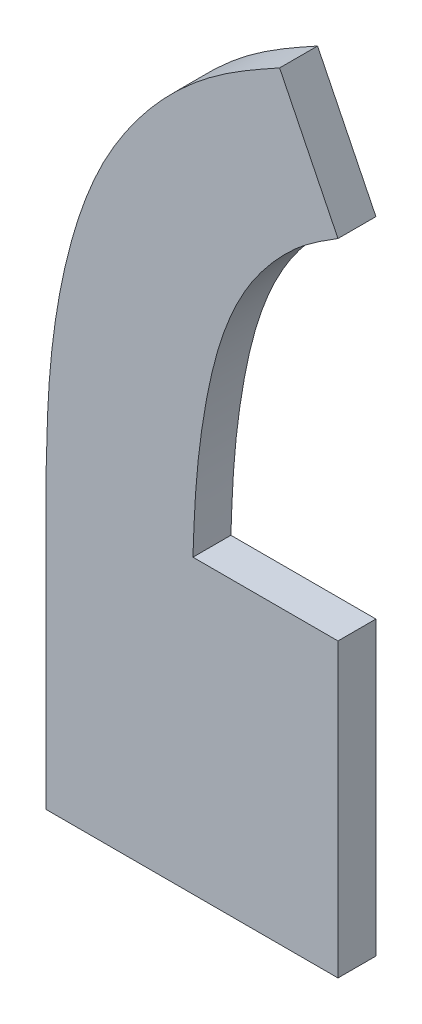
ISO-10303-21;
HEADER;
FILE_DESCRIPTION(('STEP AP214'),'2;1');
FILE_NAME('part.step','',(''),(''),'','','');
FILE_SCHEMA(('AUTOMOTIVE_DESIGN { 1 0 10303 214 1 1 1 1 }'));
ENDSEC;
DATA;
#1=APPLICATION_CONTEXT('core data for automotive mechanical design processes');
#2=APPLICATION_PROTOCOL_DEFINITION('international standard','automotive_design',2000,#1);
#3=PRODUCT_CONTEXT('',#1,'mechanical');
#4=PRODUCT('Part','Part','',(#3));
#5=PRODUCT_RELATED_PRODUCT_CATEGORY('part','',(#4));
#6=PRODUCT_DEFINITION_FORMATION('','',#4);
#7=PRODUCT_DEFINITION_CONTEXT('part definition',#1,'design');
#8=PRODUCT_DEFINITION('design','',#6,#7);
#9=PRODUCT_DEFINITION_SHAPE('','',#8);
#10=(LENGTH_UNIT() NAMED_UNIT(*) SI_UNIT(.MILLI.,.METRE.));
#11=(NAMED_UNIT(*) PLANE_ANGLE_UNIT() SI_UNIT($,.RADIAN.));
#12=(NAMED_UNIT(*) SI_UNIT($,.STERADIAN.) SOLID_ANGLE_UNIT());
#13=UNCERTAINTY_MEASURE_WITH_UNIT(LENGTH_MEASURE(1.E-05),#10,'distance_accuracy_value','');
#14=(GEOMETRIC_REPRESENTATION_CONTEXT(3) GLOBAL_UNCERTAINTY_ASSIGNED_CONTEXT((#13)) GLOBAL_UNIT_ASSIGNED_CONTEXT((#10,
#11,#12)) REPRESENTATION_CONTEXT('',''));
#15=CARTESIAN_POINT('',(0.,0.,0.));
#16=DIRECTION('',(0.,0.,1.));
#17=DIRECTION('',(1.,0.,0.));
#18=AXIS2_PLACEMENT_3D('',#15,#16,#17);
#19=CARTESIAN_POINT('',(0.0120192307692278,15.,0.5));
#20=DIRECTION('',(0.,-1.,0.));
#21=DIRECTION('',(0.,0.,-1.));
#22=AXIS2_PLACEMENT_3D('',#19,#20,#21);
#23=PLANE('',#22);
#24=DIRECTION('',(1.,0.,0.));
#25=VECTOR('',#24,1.);
#26=CARTESIAN_POINT('',(0.0120192307692278,15.,1.));
#27=LINE('',#26,#25);
#28=CARTESIAN_POINT('',(0.0120192307692278,15.,1.));
#29=VERTEX_POINT('',#28);
#30=CARTESIAN_POINT('',(1.92307692307692,15.,1.));
#31=VERTEX_POINT('',#30);
#32=EDGE_CURVE('E134',#29,#31,#27,.T.);
#33=ORIENTED_EDGE('',*,*,#32,.T.);
#34=DIRECTION('',(0.,0.,1.));
#35=VECTOR('',#34,1.);
#36=CARTESIAN_POINT('',(1.92307692307692,15.,0.5));
#37=LINE('',#36,#35);
#38=CARTESIAN_POINT('',(1.92307692307692,15.,0.5));
#39=VERTEX_POINT('',#38);
#40=EDGE_CURVE('E11',#39,#31,#37,.T.);
#41=ORIENTED_EDGE('',*,*,#40,.F.);
#42=DIRECTION('',(1.,0.,0.));
#43=VECTOR('',#42,1.);
#44=CARTESIAN_POINT('',(0.0120192307692278,15.,0.5));
#45=LINE('',#44,#43);
#46=CARTESIAN_POINT('',(0.0120192307692278,15.,0.5));
#47=VERTEX_POINT('',#46);
#48=EDGE_CURVE('E194',#47,#39,#45,.T.);
#49=ORIENTED_EDGE('',*,*,#48,.F.);
#50=DIRECTION('',(0.,0.,1.));
#51=VECTOR('',#50,1.);
#52=CARTESIAN_POINT('',(0.0120192307692278,15.,0.5));
#53=LINE('',#52,#51);
#54=EDGE_CURVE('E124',#47,#29,#53,.T.);
#55=ORIENTED_EDGE('',*,*,#54,.T.);
#56=EDGE_LOOP('',(#33,#41,#49,#55));
#57=FACE_BOUND('',#56,.T.);
#58=ADVANCED_FACE('F39',(#57),#23,.F.);
#59=CARTESIAN_POINT('',(1.92307692307692,15.,0.5));
#60=DIRECTION('',(-1.,0.,0.));
#61=DIRECTION('',(0.,0.,1.));
#62=AXIS2_PLACEMENT_3D('',#59,#60,#61);
#63=PLANE('',#62);
#64=DIRECTION('',(0.,-1.,0.));
#65=VECTOR('',#64,1.);
#66=CARTESIAN_POINT('',(1.92307692307692,15.,1.));
#67=LINE('',#66,#65);
#68=CARTESIAN_POINT('',(1.92307692307692,11.1538461538462,1.));
#69=VERTEX_POINT('',#68);
#70=EDGE_CURVE('E163',#31,#69,#67,.T.);
#71=ORIENTED_EDGE('',*,*,#70,.T.);
#72=DIRECTION('',(0.,0.,1.));
#73=VECTOR('',#72,1.);
#74=CARTESIAN_POINT('',(1.92307692307692,11.1538461538462,0.5));
#75=LINE('',#74,#73);
#76=CARTESIAN_POINT('',(1.92307692307692,11.1538461538462,0.5));
#77=VERTEX_POINT('',#76);
#78=EDGE_CURVE('E50',#77,#69,#75,.T.);
#79=ORIENTED_EDGE('',*,*,#78,.F.);
#80=DIRECTION('',(0.,-1.,0.));
#81=VECTOR('',#80,1.);
#82=CARTESIAN_POINT('',(1.92307692307692,15.,0.5));
#83=LINE('',#82,#81);
#84=EDGE_CURVE('E94',#39,#77,#83,.T.);
#85=ORIENTED_EDGE('',*,*,#84,.F.);
#86=ORIENTED_EDGE('',*,*,#40,.T.);
#87=EDGE_LOOP('',(#71,#79,#85,#86));
#88=FACE_BOUND('',#87,.T.);
#89=ADVANCED_FACE('F160',(#88),#63,.F.);
#90=CARTESIAN_POINT('',(1.92307692307692,11.1538461538462,0.5));
#91=DIRECTION('',(0.,1.,0.));
#92=DIRECTION('',(0.,0.,1.));
#93=AXIS2_PLACEMENT_3D('',#90,#91,#92);
#94=PLANE('',#93);
#95=DIRECTION('',(-1.,0.,0.));
#96=VECTOR('',#95,1.);
#97=CARTESIAN_POINT('',(1.92307692307692,11.1538461538462,1.));
#98=LINE('',#97,#96);
#99=CARTESIAN_POINT('',(-1.92307692307693,11.1538461538462,1.));
#100=VERTEX_POINT('',#99);
#101=EDGE_CURVE('E171',#69,#100,#98,.T.);
#102=ORIENTED_EDGE('',*,*,#101,.T.);
#103=DIRECTION('',(0.,0.,1.));
#104=VECTOR('',#103,1.);
#105=CARTESIAN_POINT('',(-1.92307692307693,11.1538461538462,0.5));
#106=LINE('',#105,#104);
#107=CARTESIAN_POINT('',(-1.92307692307693,11.1538461538462,0.5));
#108=VERTEX_POINT('',#107);
#109=EDGE_CURVE('E180',#108,#100,#106,.T.);
#110=ORIENTED_EDGE('',*,*,#109,.F.);
#111=DIRECTION('',(-1.,0.,0.));
#112=VECTOR('',#111,1.);
#113=CARTESIAN_POINT('',(1.92307692307692,11.1538461538462,0.5));
#114=LINE('',#113,#112);
#115=EDGE_CURVE('E176',#77,#108,#114,.T.);
#116=ORIENTED_EDGE('',*,*,#115,.F.);
#117=ORIENTED_EDGE('',*,*,#78,.T.);
#118=EDGE_LOOP('',(#102,#110,#116,#117));
#119=FACE_BOUND('',#118,.T.);
#120=ADVANCED_FACE('F151',(#119),#94,.F.);
#121=CARTESIAN_POINT('',(-1.92307692307693,11.1538461538462,0.5));
#122=DIRECTION('',(1.,0.,0.));
#123=DIRECTION('',(0.,0.,-1.));
#124=AXIS2_PLACEMENT_3D('',#121,#122,#123);
#125=PLANE('',#124);
#126=DIRECTION('',(0.,1.,0.));
#127=VECTOR('',#126,1.);
#128=CARTESIAN_POINT('',(-1.92307692307693,11.1538461538462,1.));
#129=LINE('',#128,#127);
#130=CARTESIAN_POINT('',(-1.92307692307693,15.,1.));
#131=VERTEX_POINT('',#130);
#132=EDGE_CURVE('E177',#100,#131,#129,.T.);
#133=ORIENTED_EDGE('',*,*,#132,.T.);
#134=DIRECTION('',(0.,0.,1.));
#135=VECTOR('',#134,1.);
#136=CARTESIAN_POINT('',(-1.92307692307693,15.,0.5));
#137=LINE('',#136,#135);
#138=CARTESIAN_POINT('',(-1.92307692307693,15.,0.5));
#139=VERTEX_POINT('',#138);
#140=EDGE_CURVE('E118',#139,#131,#137,.T.);
#141=ORIENTED_EDGE('',*,*,#140,.F.);
#142=DIRECTION('',(0.,1.,0.));
#143=VECTOR('',#142,1.);
#144=CARTESIAN_POINT('',(-1.92307692307693,11.1538461538462,0.5));
#145=LINE('',#144,#143);
#146=EDGE_CURVE('E112',#108,#139,#145,.T.);
#147=ORIENTED_EDGE('',*,*,#146,.F.);
#148=ORIENTED_EDGE('',*,*,#109,.T.);
#149=EDGE_LOOP('',(#133,#141,#147,#148));
#150=FACE_BOUND('',#149,.T.);
#151=ADVANCED_FACE('F152',(#150),#125,.F.);
#152=CARTESIAN_POINT('',(-1.92307692307693,15.,0.5));
#153=CARTESIAN_POINT('',(-1.91428347674863,15.3810505492982,0.5));
#154=CARTESIAN_POINT('',(-1.89751173149341,16.1078284818168,0.5));
#155=CARTESIAN_POINT('',(-1.76072914102215,17.1397191595459,0.5));
#156=CARTESIAN_POINT('',(-1.53538346627234,18.0567557613417,0.5));
#157=CARTESIAN_POINT('',(-1.21810162011556,18.870165784164,0.5));
#158=CARTESIAN_POINT('',(-0.781937433708109,19.5779612250893,0.500000000000001));
#159=CARTESIAN_POINT('',(-0.24573425601302,20.2023609067078,0.5));
#160=CARTESIAN_POINT('',(0.404415870603687,20.7374611649171,0.5));
#161=CARTESIAN_POINT('',(0.900608510826339,21.0131468045631,0.5));
#162=CARTESIAN_POINT('',(1.15384615384615,21.1538461538462,0.5));
#163=B_SPLINE_CURVE_WITH_KNOTS('',3,(#152,#153,#154,#155,#156,#157,#158,#159,#160,#161,#162),
.UNSPECIFIED.,.F.,.F.,(4,1,1,1,1,1,1,1,4),(0.,0.156605034796312,0.298692873218196,
0.426919608278893,0.544057561394536,0.656057591228239,0.766995985444929,0.881083710887764,1.),.UNSPECIFIED.);
#164=DIRECTION('',(0.,0.,1.));
#165=VECTOR('',#164,1.);
#166=SURFACE_OF_LINEAR_EXTRUSION('',#163,#165);
#167=CARTESIAN_POINT('',(-1.92307692307693,15.,1.));
#168=CARTESIAN_POINT('',(-1.91428347674863,15.3810505492982,1.));
#169=CARTESIAN_POINT('',(-1.89751173149341,16.1078284818168,1.));
#170=CARTESIAN_POINT('',(-1.76072914102215,17.1397191595459,1.));
#171=CARTESIAN_POINT('',(-1.53538346627234,18.0567557613417,1.));
#172=CARTESIAN_POINT('',(-1.21810162011556,18.870165784164,1.));
#173=CARTESIAN_POINT('',(-0.781937433708109,19.5779612250893,1.));
#174=CARTESIAN_POINT('',(-0.24573425601302,20.2023609067078,1.));
#175=CARTESIAN_POINT('',(0.404415870603687,20.7374611649171,1.));
#176=CARTESIAN_POINT('',(0.900608510826339,21.0131468045631,1.));
#177=CARTESIAN_POINT('',(1.15384615384615,21.1538461538462,1.));
#178=B_SPLINE_CURVE_WITH_KNOTS('',3,(#167,#168,#169,#170,#171,#172,#173,#174,#175,#176,#177),
.UNSPECIFIED.,.F.,.F.,(4,1,1,1,1,1,1,1,4),(0.,0.156605034796312,0.298692873218196,
0.426919608278893,0.544057561394536,0.656057591228239,0.766995985444929,0.881083710887764,1.),.UNSPECIFIED.);
#179=CARTESIAN_POINT('',(1.15384615384615,21.1538461538462,1.));
#180=VERTEX_POINT('',#179);
#181=EDGE_CURVE('E116',#131,#180,#178,.T.);
#182=ORIENTED_EDGE('',*,*,#181,.T.);
#183=DIRECTION('',(0.,0.,1.));
#184=VECTOR('',#183,1.);
#185=CARTESIAN_POINT('',(1.15384615384615,21.1538461538462,0.5));
#186=LINE('',#185,#184);
#187=CARTESIAN_POINT('',(1.15384615384615,21.1538461538462,0.5));
#188=VERTEX_POINT('',#187);
#189=EDGE_CURVE('E117',#188,#180,#186,.T.);
#190=ORIENTED_EDGE('',*,*,#189,.F.);
#191=EDGE_CURVE('E103',#139,#188,#163,.T.);
#192=ORIENTED_EDGE('',*,*,#191,.F.);
#193=ORIENTED_EDGE('',*,*,#140,.T.);
#194=EDGE_LOOP('',(#182,#190,#192,#193));
#195=FACE_BOUND('',#194,.T.);
#196=ADVANCED_FACE('F119',(#195),#166,.F.);
#197=CARTESIAN_POINT('',(1.15384615384615,21.1538461538462,0.5));
#198=DIRECTION('',(-0.897170676040539,-0.441684025127649,0.));
#199=DIRECTION('',(0.441684025127649,-0.897170676040539,0.));
#200=AXIS2_PLACEMENT_3D('',#197,#198,#199);
#201=PLANE('',#200);
#202=DIRECTION('',(0.441684025127649,-0.897170676040539,0.));
#203=VECTOR('',#202,1.);
#204=CARTESIAN_POINT('',(1.15384615384615,21.1538461538462,1.));
#205=LINE('',#204,#203);
#206=CARTESIAN_POINT('',(1.92307692307692,19.5913461538462,1.));
#207=VERTEX_POINT('',#206);
#208=EDGE_CURVE('E83',#180,#207,#205,.T.);
#209=ORIENTED_EDGE('',*,*,#208,.T.);
#210=DIRECTION('',(0.,0.,1.));
#211=VECTOR('',#210,1.);
#212=CARTESIAN_POINT('',(1.92307692307692,19.5913461538462,0.5));
#213=LINE('',#212,#211);
#214=CARTESIAN_POINT('',(1.92307692307692,19.5913461538462,0.5));
#215=VERTEX_POINT('',#214);
#216=EDGE_CURVE('E123',#215,#207,#213,.T.);
#217=ORIENTED_EDGE('',*,*,#216,.F.);
#218=DIRECTION('',(0.441684025127649,-0.897170676040539,0.));
#219=VECTOR('',#218,1.);
#220=CARTESIAN_POINT('',(1.15384615384615,21.1538461538462,0.5));
#221=LINE('',#220,#219);
#222=EDGE_CURVE('E106',#188,#215,#221,.T.);
#223=ORIENTED_EDGE('',*,*,#222,.F.);
#224=ORIENTED_EDGE('',*,*,#189,.T.);
#225=EDGE_LOOP('',(#209,#217,#223,#224));
#226=FACE_BOUND('',#225,.T.);
#227=ADVANCED_FACE('F121',(#226),#201,.F.);
#228=CARTESIAN_POINT('',(1.92307692307692,19.5913461538462,0.5));
#229=CARTESIAN_POINT('',(1.77094286688164,19.4963447049698,0.5));
#230=CARTESIAN_POINT('',(1.46819876928715,19.3072934916549,0.5));
#231=CARTESIAN_POINT('',(1.08303359543179,18.9313058475956,0.5));
#232=CARTESIAN_POINT('',(0.751943484761724,18.5007358504448,0.5));
#233=CARTESIAN_POINT('',(0.489822240621816,17.9940203563104,0.5));
#234=CARTESIAN_POINT('',(0.290655303004371,17.3979837252399,0.5));
#235=CARTESIAN_POINT('',(0.147350709441592,16.6998755972471,0.5));
#236=CARTESIAN_POINT('',(0.0437232804345663,15.8882556517103,0.5));
#237=CARTESIAN_POINT('',(0.0230431865287676,15.3088593132732,0.5));
#238=CARTESIAN_POINT('',(0.0120192307692278,15.,0.5));
#239=B_SPLINE_CURVE_WITH_KNOTS('',3,(#228,#229,#230,#231,#232,#233,#234,#235,#236,#237,#238),
.UNSPECIFIED.,.F.,.F.,(4,1,1,1,1,1,1,1,4),(0.,0.102774668661639,0.204519784048887,
0.307171967567144,0.413723555049608,0.53054363811896,0.667099473035639,0.822540424705056,1.),.UNSPECIFIED.);
#240=DIRECTION('',(0.,0.,1.));
#241=VECTOR('',#240,1.);
#242=SURFACE_OF_LINEAR_EXTRUSION('',#239,#241);
#243=CARTESIAN_POINT('',(1.92307692307692,19.5913461538462,1.));
#244=CARTESIAN_POINT('',(1.77094286688164,19.4963447049698,1.));
#245=CARTESIAN_POINT('',(1.46819876928715,19.3072934916549,1.));
#246=CARTESIAN_POINT('',(1.08303359543179,18.9313058475956,1.));
#247=CARTESIAN_POINT('',(0.751943484761724,18.5007358504448,1.));
#248=CARTESIAN_POINT('',(0.489822240621816,17.9940203563104,1.));
#249=CARTESIAN_POINT('',(0.290655303004371,17.3979837252399,1.));
#250=CARTESIAN_POINT('',(0.147350709441592,16.6998755972471,1.));
#251=CARTESIAN_POINT('',(0.0437232804345663,15.8882556517103,1.));
#252=CARTESIAN_POINT('',(0.0230431865287676,15.3088593132732,1.));
#253=CARTESIAN_POINT('',(0.0120192307692278,15.,1.));
#254=B_SPLINE_CURVE_WITH_KNOTS('',3,(#243,#244,#245,#246,#247,#248,#249,#250,#251,#252,#253),
.UNSPECIFIED.,.F.,.F.,(4,1,1,1,1,1,1,1,4),(0.,0.102774668661639,0.204519784048887,
0.307171967567144,0.413723555049608,0.53054363811896,0.667099473035639,0.822540424705056,1.),.UNSPECIFIED.);
#255=EDGE_CURVE('E90',#207,#29,#254,.T.);
#256=ORIENTED_EDGE('',*,*,#255,.T.);
#257=ORIENTED_EDGE('',*,*,#54,.F.);
#258=EDGE_CURVE('E54',#215,#47,#239,.T.);
#259=ORIENTED_EDGE('',*,*,#258,.F.);
#260=ORIENTED_EDGE('',*,*,#216,.T.);
#261=EDGE_LOOP('',(#256,#257,#259,#260));
#262=FACE_BOUND('',#261,.T.);
#263=ADVANCED_FACE('F141',(#262),#242,.F.);
#264=CARTESIAN_POINT('',(-1.32423703497494,18.5779143461657,0.5));
#265=DIRECTION('',(0.,0.,1.));
#266=DIRECTION('',(1.,0.,0.));
#267=AXIS2_PLACEMENT_3D('',#264,#265,#266);
#268=PLANE('',#267);
#269=ORIENTED_EDGE('',*,*,#48,.T.);
#270=ORIENTED_EDGE('',*,*,#84,.T.);
#271=ORIENTED_EDGE('',*,*,#115,.T.);
#272=ORIENTED_EDGE('',*,*,#146,.T.);
#273=ORIENTED_EDGE('',*,*,#191,.T.);
#274=ORIENTED_EDGE('',*,*,#222,.T.);
#275=ORIENTED_EDGE('',*,*,#258,.T.);
#276=EDGE_LOOP('',(#269,#270,#271,#272,#273,#274,#275));
#277=FACE_BOUND('',#276,.T.);
#278=ADVANCED_FACE('F109',(#277),#268,.F.);
#279=CARTESIAN_POINT('',(-1.32423703497494,18.5779143461657,1.));
#280=DIRECTION('',(0.,0.,1.));
#281=DIRECTION('',(1.,0.,0.));
#282=AXIS2_PLACEMENT_3D('',#279,#280,#281);
#283=PLANE('',#282);
#284=ORIENTED_EDGE('',*,*,#32,.F.);
#285=ORIENTED_EDGE('',*,*,#255,.F.);
#286=ORIENTED_EDGE('',*,*,#208,.F.);
#287=ORIENTED_EDGE('',*,*,#181,.F.);
#288=ORIENTED_EDGE('',*,*,#132,.F.);
#289=ORIENTED_EDGE('',*,*,#101,.F.);
#290=ORIENTED_EDGE('',*,*,#70,.F.);
#291=EDGE_LOOP('',(#284,#285,#286,#287,#288,#289,#290));
#292=FACE_BOUND('',#291,.T.);
#293=ADVANCED_FACE('F144',(#292),#283,.T.);
#294=CLOSED_SHELL('',(#58,#89,#120,#151,#196,#227,#263,#278,#293));
#295=MANIFOLD_SOLID_BREP('B2',#294);
#296=ADVANCED_BREP_SHAPE_REPRESENTATION('',(#18,#295),#14);
#297=SHAPE_DEFINITION_REPRESENTATION(#9,#296);
ENDSEC;
END-ISO-10303-21;
